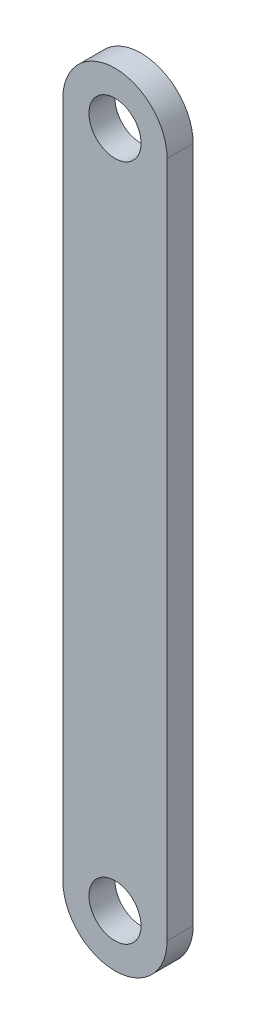
ISO-10303-21;
HEADER;
FILE_DESCRIPTION(('STEP AP214'),'2;1');
FILE_NAME('part.step','',(''),(''),'','','');
FILE_SCHEMA(('AUTOMOTIVE_DESIGN { 1 0 10303 214 1 1 1 1 }'));
ENDSEC;
DATA;
#1=APPLICATION_CONTEXT('core data for automotive mechanical design processes');
#2=APPLICATION_PROTOCOL_DEFINITION('international standard','automotive_design',2000,#1);
#3=PRODUCT_CONTEXT('',#1,'mechanical');
#4=PRODUCT('Part','Part','',(#3));
#5=PRODUCT_RELATED_PRODUCT_CATEGORY('part','',(#4));
#6=PRODUCT_DEFINITION_FORMATION('','',#4);
#7=PRODUCT_DEFINITION_CONTEXT('part definition',#1,'design');
#8=PRODUCT_DEFINITION('design','',#6,#7);
#9=PRODUCT_DEFINITION_SHAPE('','',#8);
#10=(LENGTH_UNIT() NAMED_UNIT(*) SI_UNIT(.MILLI.,.METRE.));
#11=(NAMED_UNIT(*) PLANE_ANGLE_UNIT() SI_UNIT($,.RADIAN.));
#12=(NAMED_UNIT(*) SI_UNIT($,.STERADIAN.) SOLID_ANGLE_UNIT());
#13=UNCERTAINTY_MEASURE_WITH_UNIT(LENGTH_MEASURE(1.E-05),#10,'distance_accuracy_value','');
#14=(GEOMETRIC_REPRESENTATION_CONTEXT(3) GLOBAL_UNCERTAINTY_ASSIGNED_CONTEXT((#13)) GLOBAL_UNIT_ASSIGNED_CONTEXT((#10,
#11,#12)) REPRESENTATION_CONTEXT('',''));
#15=CARTESIAN_POINT('',(0.,0.,0.));
#16=DIRECTION('',(0.,0.,1.));
#17=DIRECTION('',(1.,0.,0.));
#18=AXIS2_PLACEMENT_3D('',#15,#16,#17);
#19=CARTESIAN_POINT('',(0.,-330.2,12.7));
#20=DIRECTION('',(0.,0.,1.));
#21=DIRECTION('',(1.,0.,0.));
#22=AXIS2_PLACEMENT_3D('',#19,#20,#21);
#23=PLANE('',#22);
#24=CARTESIAN_POINT('',(0.,0.,12.7));
#25=DIRECTION('',(0.,0.,1.));
#26=DIRECTION('',(1.,0.,0.));
#27=AXIS2_PLACEMENT_3D('',#24,#25,#26);
#28=CIRCLE('',#27,12.7);
#29=CARTESIAN_POINT('',(12.7,0.,12.7));
#30=VERTEX_POINT('',#29);
#31=EDGE_CURVE('E104',#30,#30,#28,.T.);
#32=ORIENTED_EDGE('',*,*,#31,.F.);
#33=EDGE_LOOP('',(#32));
#34=FACE_BOUND('',#33,.T.);
#35=CARTESIAN_POINT('',(0.,-330.2,12.7));
#36=DIRECTION('',(0.,0.,1.));
#37=DIRECTION('',(1.,0.,0.));
#38=AXIS2_PLACEMENT_3D('',#35,#36,#37);
#39=CIRCLE('',#38,25.4);
#40=CARTESIAN_POINT('',(-25.4,-330.2,12.7));
#41=VERTEX_POINT('',#40);
#42=CARTESIAN_POINT('',(25.4,-330.2,12.7));
#43=VERTEX_POINT('',#42);
#44=EDGE_CURVE('E89',#41,#43,#39,.T.);
#45=ORIENTED_EDGE('',*,*,#44,.T.);
#46=DIRECTION('',(0.,1.,0.));
#47=VECTOR('',#46,1.);
#48=CARTESIAN_POINT('',(25.3999999999999,0.,12.7));
#49=LINE('',#48,#47);
#50=CARTESIAN_POINT('',(25.3999999999999,0.,12.7));
#51=VERTEX_POINT('',#50);
#52=EDGE_CURVE('E84',#43,#51,#49,.T.);
#53=ORIENTED_EDGE('',*,*,#52,.T.);
#54=CARTESIAN_POINT('',(0.,0.,12.7));
#55=DIRECTION('',(0.,0.,1.));
#56=DIRECTION('',(1.,0.,0.));
#57=AXIS2_PLACEMENT_3D('',#54,#55,#56);
#58=CIRCLE('',#57,25.3999999999999);
#59=CARTESIAN_POINT('',(-25.3999999999999,0.,12.7));
#60=VERTEX_POINT('',#59);
#61=EDGE_CURVE('E87',#51,#60,#58,.T.);
#62=ORIENTED_EDGE('',*,*,#61,.T.);
#63=DIRECTION('',(0.,-1.,0.));
#64=VECTOR('',#63,1.);
#65=CARTESIAN_POINT('',(-25.4,-330.2,12.7));
#66=LINE('',#65,#64);
#67=EDGE_CURVE('E54',#60,#41,#66,.T.);
#68=ORIENTED_EDGE('',*,*,#67,.T.);
#69=EDGE_LOOP('',(#45,#53,#62,#68));
#70=FACE_BOUND('',#69,.T.);
#71=CARTESIAN_POINT('',(0.,-330.2,12.7));
#72=DIRECTION('',(0.,0.,1.));
#73=DIRECTION('',(1.,0.,0.));
#74=AXIS2_PLACEMENT_3D('',#71,#72,#73);
#75=CIRCLE('',#74,12.7);
#76=CARTESIAN_POINT('',(12.7,-330.2,12.7));
#77=VERTEX_POINT('',#76);
#78=EDGE_CURVE('E119',#77,#77,#75,.T.);
#79=ORIENTED_EDGE('',*,*,#78,.F.);
#80=EDGE_LOOP('',(#79));
#81=FACE_BOUND('',#80,.T.);
#82=ADVANCED_FACE('F37',(#34,#70,#81),#23,.T.);
#83=CARTESIAN_POINT('',(0.,-330.2,0.));
#84=DIRECTION('',(0.,0.,1.));
#85=DIRECTION('',(1.,0.,0.));
#86=AXIS2_PLACEMENT_3D('',#83,#84,#85);
#87=PLANE('',#86);
#88=CARTESIAN_POINT('',(0.,-330.2,0.));
#89=DIRECTION('',(0.,0.,1.));
#90=DIRECTION('',(1.,0.,0.));
#91=AXIS2_PLACEMENT_3D('',#88,#89,#90);
#92=CIRCLE('',#91,25.4);
#93=CARTESIAN_POINT('',(-25.4,-330.2,0.));
#94=VERTEX_POINT('',#93);
#95=CARTESIAN_POINT('',(25.4,-330.2,0.));
#96=VERTEX_POINT('',#95);
#97=EDGE_CURVE('E101',#94,#96,#92,.T.);
#98=ORIENTED_EDGE('',*,*,#97,.F.);
#99=DIRECTION('',(0.,-1.,0.));
#100=VECTOR('',#99,1.);
#101=CARTESIAN_POINT('',(-25.4,-330.2,0.));
#102=LINE('',#101,#100);
#103=CARTESIAN_POINT('',(-25.3999999999999,0.,0.));
#104=VERTEX_POINT('',#103);
#105=EDGE_CURVE('E77',#104,#94,#102,.T.);
#106=ORIENTED_EDGE('',*,*,#105,.F.);
#107=CARTESIAN_POINT('',(0.,0.,0.));
#108=DIRECTION('',(0.,0.,1.));
#109=DIRECTION('',(1.,0.,0.));
#110=AXIS2_PLACEMENT_3D('',#107,#108,#109);
#111=CIRCLE('',#110,25.3999999999999);
#112=CARTESIAN_POINT('',(25.3999999999999,0.,0.));
#113=VERTEX_POINT('',#112);
#114=EDGE_CURVE('E71',#113,#104,#111,.T.);
#115=ORIENTED_EDGE('',*,*,#114,.F.);
#116=DIRECTION('',(0.,1.,0.));
#117=VECTOR('',#116,1.);
#118=CARTESIAN_POINT('',(25.3999999999999,0.,0.));
#119=LINE('',#118,#117);
#120=EDGE_CURVE('E93',#96,#113,#119,.T.);
#121=ORIENTED_EDGE('',*,*,#120,.F.);
#122=EDGE_LOOP('',(#98,#106,#115,#121));
#123=FACE_BOUND('',#122,.T.);
#124=CARTESIAN_POINT('',(0.,0.,0.));
#125=DIRECTION('',(0.,0.,1.));
#126=DIRECTION('',(1.,0.,0.));
#127=AXIS2_PLACEMENT_3D('',#124,#125,#126);
#128=CIRCLE('',#127,12.7);
#129=CARTESIAN_POINT('',(12.7,0.,0.));
#130=VERTEX_POINT('',#129);
#131=EDGE_CURVE('E116',#130,#130,#128,.T.);
#132=ORIENTED_EDGE('',*,*,#131,.T.);
#133=EDGE_LOOP('',(#132));
#134=FACE_BOUND('',#133,.T.);
#135=CARTESIAN_POINT('',(0.,-330.2,0.));
#136=DIRECTION('',(0.,0.,1.));
#137=DIRECTION('',(1.,0.,0.));
#138=AXIS2_PLACEMENT_3D('',#135,#136,#137);
#139=CIRCLE('',#138,12.7);
#140=CARTESIAN_POINT('',(12.7,-330.2,0.));
#141=VERTEX_POINT('',#140);
#142=EDGE_CURVE('E122',#141,#141,#139,.T.);
#143=ORIENTED_EDGE('',*,*,#142,.T.);
#144=EDGE_LOOP('',(#143));
#145=FACE_BOUND('',#144,.T.);
#146=ADVANCED_FACE('F112',(#123,#134,#145),#87,.F.);
#147=CARTESIAN_POINT('',(0.,-330.2,12.7));
#148=DIRECTION('',(0.,0.,-1.));
#149=DIRECTION('',(-1.,0.,0.));
#150=AXIS2_PLACEMENT_3D('',#147,#148,#149);
#151=CYLINDRICAL_SURFACE('',#150,25.4);
#152=ORIENTED_EDGE('',*,*,#97,.T.);
#153=DIRECTION('',(0.,0.,-1.));
#154=VECTOR('',#153,1.);
#155=CARTESIAN_POINT('',(25.4,-330.2,12.7));
#156=LINE('',#155,#154);
#157=EDGE_CURVE('E11',#43,#96,#156,.T.);
#158=ORIENTED_EDGE('',*,*,#157,.F.);
#159=ORIENTED_EDGE('',*,*,#44,.F.);
#160=DIRECTION('',(0.,0.,-1.));
#161=VECTOR('',#160,1.);
#162=CARTESIAN_POINT('',(-25.4,-330.2,12.7));
#163=LINE('',#162,#161);
#164=EDGE_CURVE('E97',#41,#94,#163,.T.);
#165=ORIENTED_EDGE('',*,*,#164,.T.);
#166=EDGE_LOOP('',(#152,#158,#159,#165));
#167=FACE_BOUND('',#166,.T.);
#168=ADVANCED_FACE('F39',(#167),#151,.T.);
#169=CARTESIAN_POINT('',(25.3999999999999,0.,12.7));
#170=DIRECTION('',(-1.,0.,0.));
#171=DIRECTION('',(0.,-1.,0.));
#172=AXIS2_PLACEMENT_3D('',#169,#170,#171);
#173=PLANE('',#172);
#174=ORIENTED_EDGE('',*,*,#120,.T.);
#175=DIRECTION('',(0.,0.,-1.));
#176=VECTOR('',#175,1.);
#177=CARTESIAN_POINT('',(25.3999999999999,0.,12.7));
#178=LINE('',#177,#176);
#179=EDGE_CURVE('E46',#51,#113,#178,.T.);
#180=ORIENTED_EDGE('',*,*,#179,.F.);
#181=ORIENTED_EDGE('',*,*,#52,.F.);
#182=ORIENTED_EDGE('',*,*,#157,.T.);
#183=EDGE_LOOP('',(#174,#180,#181,#182));
#184=FACE_BOUND('',#183,.T.);
#185=ADVANCED_FACE('F92',(#184),#173,.F.);
#186=CARTESIAN_POINT('',(0.,0.,12.7));
#187=DIRECTION('',(0.,0.,-1.));
#188=DIRECTION('',(-1.,0.,0.));
#189=AXIS2_PLACEMENT_3D('',#186,#187,#188);
#190=CYLINDRICAL_SURFACE('',#189,25.3999999999999);
#191=ORIENTED_EDGE('',*,*,#114,.T.);
#192=DIRECTION('',(0.,0.,-1.));
#193=VECTOR('',#192,1.);
#194=CARTESIAN_POINT('',(-25.3999999999999,0.,12.7));
#195=LINE('',#194,#193);
#196=EDGE_CURVE('E94',#60,#104,#195,.T.);
#197=ORIENTED_EDGE('',*,*,#196,.F.);
#198=ORIENTED_EDGE('',*,*,#61,.F.);
#199=ORIENTED_EDGE('',*,*,#179,.T.);
#200=EDGE_LOOP('',(#191,#197,#198,#199));
#201=FACE_BOUND('',#200,.T.);
#202=ADVANCED_FACE('F95',(#201),#190,.T.);
#203=CARTESIAN_POINT('',(-25.4,-330.2,12.7));
#204=DIRECTION('',(1.,0.,0.));
#205=DIRECTION('',(0.,1.,0.));
#206=AXIS2_PLACEMENT_3D('',#203,#204,#205);
#207=PLANE('',#206);
#208=ORIENTED_EDGE('',*,*,#105,.T.);
#209=ORIENTED_EDGE('',*,*,#164,.F.);
#210=ORIENTED_EDGE('',*,*,#67,.F.);
#211=ORIENTED_EDGE('',*,*,#196,.T.);
#212=EDGE_LOOP('',(#208,#209,#210,#211));
#213=FACE_BOUND('',#212,.T.);
#214=ADVANCED_FACE('F109',(#213),#207,.F.);
#215=CARTESIAN_POINT('',(0.,0.,12.7));
#216=DIRECTION('',(0.,0.,-1.));
#217=DIRECTION('',(-1.,0.,0.));
#218=AXIS2_PLACEMENT_3D('',#215,#216,#217);
#219=CYLINDRICAL_SURFACE('',#218,12.7);
#220=ORIENTED_EDGE('',*,*,#31,.T.);
#221=EDGE_LOOP('',(#220));
#222=FACE_BOUND('',#221,.T.);
#223=ORIENTED_EDGE('',*,*,#131,.F.);
#224=EDGE_LOOP('',(#223));
#225=FACE_BOUND('',#224,.T.);
#226=ADVANCED_FACE('F139',(#222,#225),#219,.F.);
#227=CARTESIAN_POINT('',(0.,-330.2,12.7));
#228=DIRECTION('',(0.,0.,-1.));
#229=DIRECTION('',(-1.,0.,0.));
#230=AXIS2_PLACEMENT_3D('',#227,#228,#229);
#231=CYLINDRICAL_SURFACE('',#230,12.7);
#232=ORIENTED_EDGE('',*,*,#78,.T.);
#233=EDGE_LOOP('',(#232));
#234=FACE_BOUND('',#233,.T.);
#235=ORIENTED_EDGE('',*,*,#142,.F.);
#236=EDGE_LOOP('',(#235));
#237=FACE_BOUND('',#236,.T.);
#238=ADVANCED_FACE('F128',(#234,#237),#231,.F.);
#239=CLOSED_SHELL('',(#82,#146,#168,#185,#202,#214,#226,#238));
#240=MANIFOLD_SOLID_BREP('B2',#239);
#241=ADVANCED_BREP_SHAPE_REPRESENTATION('',(#18,#240),#14);
#242=SHAPE_DEFINITION_REPRESENTATION(#9,#241);
ENDSEC;
END-ISO-10303-21;
